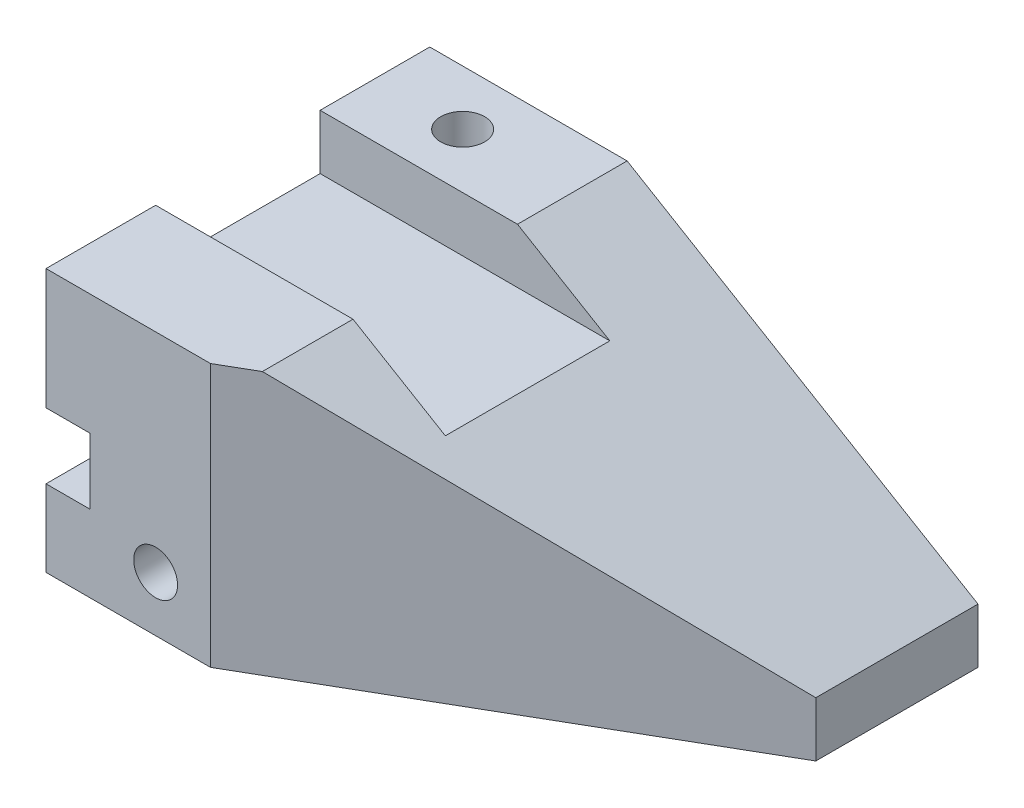
ISO-10303-21;
HEADER;
FILE_DESCRIPTION(('STEP AP214'),'2;1');
FILE_NAME('part.step','',(''),(''),'','','');
FILE_SCHEMA(('AUTOMOTIVE_DESIGN { 1 0 10303 214 1 1 1 1 }'));
ENDSEC;
DATA;
#1=APPLICATION_CONTEXT('core data for automotive mechanical design processes');
#2=APPLICATION_PROTOCOL_DEFINITION('international standard','automotive_design',2000,#1);
#3=PRODUCT_CONTEXT('',#1,'mechanical');
#4=PRODUCT('Part','Part','',(#3));
#5=PRODUCT_RELATED_PRODUCT_CATEGORY('part','',(#4));
#6=PRODUCT_DEFINITION_FORMATION('','',#4);
#7=PRODUCT_DEFINITION_CONTEXT('part definition',#1,'design');
#8=PRODUCT_DEFINITION('design','',#6,#7);
#9=PRODUCT_DEFINITION_SHAPE('','',#8);
#10=(LENGTH_UNIT() NAMED_UNIT(*) SI_UNIT(.MILLI.,.METRE.));
#11=(NAMED_UNIT(*) PLANE_ANGLE_UNIT() SI_UNIT($,.RADIAN.));
#12=(NAMED_UNIT(*) SI_UNIT($,.STERADIAN.) SOLID_ANGLE_UNIT());
#13=UNCERTAINTY_MEASURE_WITH_UNIT(LENGTH_MEASURE(1.E-05),#10,'distance_accuracy_value','');
#14=(GEOMETRIC_REPRESENTATION_CONTEXT(3) GLOBAL_UNCERTAINTY_ASSIGNED_CONTEXT((#13)) GLOBAL_UNIT_ASSIGNED_CONTEXT((#10,
#11,#12)) REPRESENTATION_CONTEXT('',''));
#15=CARTESIAN_POINT('',(0.,0.,0.));
#16=DIRECTION('',(0.,0.,1.));
#17=DIRECTION('',(1.,0.,0.));
#18=AXIS2_PLACEMENT_3D('',#15,#16,#17);
#19=CARTESIAN_POINT('',(0.,0.,175.));
#20=DIRECTION('',(0.,0.,1.));
#21=DIRECTION('',(1.,0.,0.));
#22=AXIS2_PLACEMENT_3D('',#19,#20,#21);
#23=PLANE('',#22);
#24=CARTESIAN_POINT('',(50.,25.,175.));
#25=DIRECTION('',(0.,0.,1.));
#26=DIRECTION('',(1.,0.,0.));
#27=AXIS2_PLACEMENT_3D('',#24,#25,#26);
#28=CIRCLE('',#27,10.);
#29=CARTESIAN_POINT('',(60.,25.,175.));
#30=VERTEX_POINT('',#29);
#31=EDGE_CURVE('E239',#30,#30,#28,.T.);
#32=ORIENTED_EDGE('',*,*,#31,.F.);
#33=EDGE_LOOP('',(#32));
#34=FACE_BOUND('',#33,.T.);
#35=DIRECTION('',(0.,-1.,0.));
#36=VECTOR('',#35,1.);
#37=CARTESIAN_POINT('',(20.,65.,175.));
#38=LINE('',#37,#36);
#39=CARTESIAN_POINT('',(20.,65.,175.));
#40=VERTEX_POINT('',#39);
#41=CARTESIAN_POINT('',(20.,35.,175.));
#42=VERTEX_POINT('',#41);
#43=EDGE_CURVE('E167',#40,#42,#38,.T.);
#44=ORIENTED_EDGE('',*,*,#43,.T.);
#45=DIRECTION('',(-1.,0.,0.));
#46=VECTOR('',#45,1.);
#47=CARTESIAN_POINT('',(20.,35.,175.));
#48=LINE('',#47,#46);
#49=CARTESIAN_POINT('',(0.,35.,175.));
#50=VERTEX_POINT('',#49);
#51=EDGE_CURVE('E152',#42,#50,#48,.T.);
#52=ORIENTED_EDGE('',*,*,#51,.T.);
#53=DIRECTION('',(0.,-1.,0.));
#54=VECTOR('',#53,1.);
#55=CARTESIAN_POINT('',(0.,120.,175.));
#56=LINE('',#55,#54);
#57=CARTESIAN_POINT('',(0.,0.,175.));
#58=VERTEX_POINT('',#57);
#59=EDGE_CURVE('E164',#50,#58,#56,.T.);
#60=ORIENTED_EDGE('',*,*,#59,.T.);
#61=DIRECTION('',(1.,0.,0.));
#62=VECTOR('',#61,1.);
#63=CARTESIAN_POINT('',(0.,0.,175.));
#64=LINE('',#63,#62);
#65=CARTESIAN_POINT('',(75.,0.,175.));
#66=VERTEX_POINT('',#65);
#67=EDGE_CURVE('E182',#58,#66,#64,.T.);
#68=ORIENTED_EDGE('',*,*,#67,.T.);
#69=DIRECTION('',(0.,1.,0.));
#70=VECTOR('',#69,1.);
#71=CARTESIAN_POINT('',(75.,0.,175.));
#72=LINE('',#71,#70);
#73=CARTESIAN_POINT('',(75.,120.,175.));
#74=VERTEX_POINT('',#73);
#75=EDGE_CURVE('E229',#66,#74,#72,.T.);
#76=ORIENTED_EDGE('',*,*,#75,.T.);
#77=DIRECTION('',(-1.,0.,0.));
#78=VECTOR('',#77,1.);
#79=CARTESIAN_POINT('',(90.,120.,175.));
#80=LINE('',#79,#78);
#81=CARTESIAN_POINT('',(0.,120.,175.));
#82=VERTEX_POINT('',#81);
#83=EDGE_CURVE('E192',#74,#82,#80,.T.);
#84=ORIENTED_EDGE('',*,*,#83,.T.);
#85=CARTESIAN_POINT('',(0.,65.,175.));
#86=VERTEX_POINT('',#85);
#87=EDGE_CURVE('E176',#82,#86,#56,.T.);
#88=ORIENTED_EDGE('',*,*,#87,.T.);
#89=DIRECTION('',(1.,0.,0.));
#90=VECTOR('',#89,1.);
#91=CARTESIAN_POINT('',(0.,65.,175.));
#92=LINE('',#91,#90);
#93=EDGE_CURVE('E169',#86,#40,#92,.T.);
#94=ORIENTED_EDGE('',*,*,#93,.T.);
#95=EDGE_LOOP('',(#44,#52,#60,#68,#76,#84,#88,#94));
#96=FACE_BOUND('',#95,.T.);
#97=ADVANCED_FACE('F39',(#34,#96),#23,.T.);
#98=CARTESIAN_POINT('',(0.,120.,175.));
#99=DIRECTION('',(1.,0.,0.));
#100=DIRECTION('',(0.,1.,0.));
#101=AXIS2_PLACEMENT_3D('',#98,#99,#100);
#102=PLANE('',#101);
#103=DIRECTION('',(0.,0.,1.));
#104=VECTOR('',#103,1.);
#105=CARTESIAN_POINT('',(0.,35.,-45.0000000000001));
#106=LINE('',#105,#104);
#107=CARTESIAN_POINT('',(0.,35.,0.));
#108=VERTEX_POINT('',#107);
#109=EDGE_CURVE('E148',#108,#50,#106,.T.);
#110=ORIENTED_EDGE('',*,*,#109,.F.);
#111=DIRECTION('',(0.,-1.,0.));
#112=VECTOR('',#111,1.);
#113=CARTESIAN_POINT('',(0.,120.,0.));
#114=LINE('',#113,#112);
#115=CARTESIAN_POINT('',(0.,0.,0.));
#116=VERTEX_POINT('',#115);
#117=EDGE_CURVE('E201',#108,#116,#114,.T.);
#118=ORIENTED_EDGE('',*,*,#117,.T.);
#119=DIRECTION('',(0.,0.,-1.));
#120=VECTOR('',#119,1.);
#121=CARTESIAN_POINT('',(0.,0.,175.));
#122=LINE('',#121,#120);
#123=EDGE_CURVE('E174',#58,#116,#122,.T.);
#124=ORIENTED_EDGE('',*,*,#123,.F.);
#125=ORIENTED_EDGE('',*,*,#59,.F.);
#126=EDGE_LOOP('',(#110,#118,#124,#125));
#127=FACE_BOUND('',#126,.T.);
#128=ADVANCED_FACE('F41',(#127),#102,.F.);
#129=DIRECTION('',(0.,0.,1.));
#130=VECTOR('',#129,1.);
#131=CARTESIAN_POINT('',(0.,65.,-45.0000000000001));
#132=LINE('',#131,#130);
#133=CARTESIAN_POINT('',(0.,65.,0.));
#134=VERTEX_POINT('',#133);
#135=EDGE_CURVE('E160',#134,#86,#132,.T.);
#136=ORIENTED_EDGE('',*,*,#135,.T.);
#137=ORIENTED_EDGE('',*,*,#87,.F.);
#138=DIRECTION('',(0.,0.,-1.));
#139=VECTOR('',#138,1.);
#140=CARTESIAN_POINT('',(0.,120.,175.));
#141=LINE('',#140,#139);
#142=CARTESIAN_POINT('',(0.,120.,125.));
#143=VERTEX_POINT('',#142);
#144=EDGE_CURVE('E212',#82,#143,#141,.T.);
#145=ORIENTED_EDGE('',*,*,#144,.T.);
#146=DIRECTION('',(0.,1.,0.));
#147=VECTOR('',#146,1.);
#148=CARTESIAN_POINT('',(0.,95.,125.));
#149=LINE('',#148,#147);
#150=CARTESIAN_POINT('',(0.,95.,125.));
#151=VERTEX_POINT('',#150);
#152=EDGE_CURVE('E271',#151,#143,#149,.T.);
#153=ORIENTED_EDGE('',*,*,#152,.F.);
#154=DIRECTION('',(0.,0.,1.));
#155=VECTOR('',#154,1.);
#156=CARTESIAN_POINT('',(0.,95.,50.));
#157=LINE('',#156,#155);
#158=CARTESIAN_POINT('',(0.,95.,50.));
#159=VERTEX_POINT('',#158);
#160=EDGE_CURVE('E267',#159,#151,#157,.T.);
#161=ORIENTED_EDGE('',*,*,#160,.F.);
#162=DIRECTION('',(0.,-1.,0.));
#163=VECTOR('',#162,1.);
#164=CARTESIAN_POINT('',(0.,120.,50.));
#165=LINE('',#164,#163);
#166=CARTESIAN_POINT('',(0.,120.,50.));
#167=VERTEX_POINT('',#166);
#168=EDGE_CURVE('E159',#167,#159,#165,.T.);
#169=ORIENTED_EDGE('',*,*,#168,.F.);
#170=CARTESIAN_POINT('',(0.,120.,0.));
#171=VERTEX_POINT('',#170);
#172=EDGE_CURVE('E195',#167,#171,#141,.T.);
#173=ORIENTED_EDGE('',*,*,#172,.T.);
#174=EDGE_CURVE('E196',#171,#134,#114,.T.);
#175=ORIENTED_EDGE('',*,*,#174,.T.);
#176=EDGE_LOOP('',(#136,#137,#145,#153,#161,#169,#173,#175));
#177=FACE_BOUND('',#176,.T.);
#178=ADVANCED_FACE('F328',(#177),#102,.F.);
#179=CARTESIAN_POINT('',(0.,0.,0.));
#180=DIRECTION('',(0.,0.,1.));
#181=DIRECTION('',(1.,0.,0.));
#182=AXIS2_PLACEMENT_3D('',#179,#180,#181);
#183=PLANE('',#182);
#184=CARTESIAN_POINT('',(50.,25.,0.));
#185=DIRECTION('',(0.,0.,1.));
#186=DIRECTION('',(1.,0.,0.));
#187=AXIS2_PLACEMENT_3D('',#184,#185,#186);
#188=CIRCLE('',#187,10.);
#189=CARTESIAN_POINT('',(60.,25.,0.));
#190=VERTEX_POINT('',#189);
#191=EDGE_CURVE('E170',#190,#190,#188,.T.);
#192=ORIENTED_EDGE('',*,*,#191,.T.);
#193=EDGE_LOOP('',(#192));
#194=FACE_BOUND('',#193,.T.);
#195=DIRECTION('',(-1.,0.,0.));
#196=VECTOR('',#195,1.);
#197=CARTESIAN_POINT('',(0.,35.,0.));
#198=LINE('',#197,#196);
#199=CARTESIAN_POINT('',(20.,35.,0.));
#200=VERTEX_POINT('',#199);
#201=EDGE_CURVE('E11',#200,#108,#198,.T.);
#202=ORIENTED_EDGE('',*,*,#201,.F.);
#203=DIRECTION('',(0.,-1.,0.));
#204=VECTOR('',#203,1.);
#205=CARTESIAN_POINT('',(20.,0.,0.));
#206=LINE('',#205,#204);
#207=CARTESIAN_POINT('',(20.,65.,0.));
#208=VERTEX_POINT('',#207);
#209=EDGE_CURVE('E233',#208,#200,#206,.T.);
#210=ORIENTED_EDGE('',*,*,#209,.F.);
#211=DIRECTION('',(1.,0.,0.));
#212=VECTOR('',#211,1.);
#213=CARTESIAN_POINT('',(0.,65.,0.));
#214=LINE('',#213,#212);
#215=EDGE_CURVE('E54',#134,#208,#214,.T.);
#216=ORIENTED_EDGE('',*,*,#215,.F.);
#217=ORIENTED_EDGE('',*,*,#174,.F.);
#218=DIRECTION('',(-1.,0.,0.));
#219=VECTOR('',#218,1.);
#220=CARTESIAN_POINT('',(90.,120.,0.));
#221=LINE('',#220,#219);
#222=CARTESIAN_POINT('',(90.,120.,0.));
#223=VERTEX_POINT('',#222);
#224=EDGE_CURVE('E177',#223,#171,#221,.T.);
#225=ORIENTED_EDGE('',*,*,#224,.F.);
#226=DIRECTION('',(-0.859854743840735,0.510538754155436,0.));
#227=VECTOR('',#226,1.);
#228=CARTESIAN_POINT('',(250.,25.,0.));
#229=LINE('',#228,#227);
#230=CARTESIAN_POINT('',(250.,25.,0.));
#231=VERTEX_POINT('',#230);
#232=EDGE_CURVE('E184',#231,#223,#229,.T.);
#233=ORIENTED_EDGE('',*,*,#232,.F.);
#234=DIRECTION('',(0.,1.,0.));
#235=VECTOR('',#234,1.);
#236=CARTESIAN_POINT('',(250.,0.,0.));
#237=LINE('',#236,#235);
#238=CARTESIAN_POINT('',(250.,0.,0.));
#239=VERTEX_POINT('',#238);
#240=EDGE_CURVE('E205',#239,#231,#237,.T.);
#241=ORIENTED_EDGE('',*,*,#240,.F.);
#242=DIRECTION('',(1.,0.,0.));
#243=VECTOR('',#242,1.);
#244=CARTESIAN_POINT('',(0.,0.,0.));
#245=LINE('',#244,#243);
#246=EDGE_CURVE('E200',#116,#239,#245,.T.);
#247=ORIENTED_EDGE('',*,*,#246,.F.);
#248=ORIENTED_EDGE('',*,*,#117,.F.);
#249=EDGE_LOOP('',(#202,#210,#216,#217,#225,#233,#241,#247,#248));
#250=FACE_BOUND('',#249,.T.);
#251=ADVANCED_FACE('F315',(#194,#250),#183,.F.);
#252=CARTESIAN_POINT('',(90.,120.,175.));
#253=DIRECTION('',(0.,-1.,0.));
#254=DIRECTION('',(1.,0.,0.));
#255=AXIS2_PLACEMENT_3D('',#252,#253,#254);
#256=PLANE('',#255);
#257=DIRECTION('',(0.,0.,-1.));
#258=VECTOR('',#257,1.);
#259=CARTESIAN_POINT('',(90.,120.,175.));
#260=LINE('',#259,#258);
#261=CARTESIAN_POINT('',(90.,120.,166.339745962156));
#262=VERTEX_POINT('',#261);
#263=CARTESIAN_POINT('',(90.,120.,125.));
#264=VERTEX_POINT('',#263);
#265=EDGE_CURVE('E217',#262,#264,#260,.T.);
#266=ORIENTED_EDGE('',*,*,#265,.T.);
#267=DIRECTION('',(-1.,0.,0.));
#268=VECTOR('',#267,1.);
#269=CARTESIAN_POINT('',(220.,120.,125.));
#270=LINE('',#269,#268);
#271=EDGE_CURVE('E274',#264,#143,#270,.T.);
#272=ORIENTED_EDGE('',*,*,#271,.T.);
#273=ORIENTED_EDGE('',*,*,#144,.F.);
#274=ORIENTED_EDGE('',*,*,#83,.F.);
#275=DIRECTION('',(-0.866025403784438,0.,0.500000000000001));
#276=VECTOR('',#275,1.);
#277=CARTESIAN_POINT('',(86.25,120.,168.504809471617));
#278=LINE('',#277,#276);
#279=EDGE_CURVE('E305',#262,#74,#278,.T.);
#280=ORIENTED_EDGE('',*,*,#279,.F.);
#281=EDGE_LOOP('',(#266,#272,#273,#274,#280));
#282=FACE_BOUND('',#281,.T.);
#283=ADVANCED_FACE('F323',(#282),#256,.F.);
#284=CARTESIAN_POINT('',(0.,0.,175.));
#285=DIRECTION('',(0.,1.,0.));
#286=DIRECTION('',(0.,0.,1.));
#287=AXIS2_PLACEMENT_3D('',#284,#285,#286);
#288=PLANE('',#287);
#289=CARTESIAN_POINT('',(40.,0.,25.));
#290=DIRECTION('',(0.,1.,0.));
#291=DIRECTION('',(0.,0.,1.));
#292=AXIS2_PLACEMENT_3D('',#289,#290,#291);
#293=CIRCLE('',#292,9.99999999999999);
#294=CARTESIAN_POINT('',(40.,0.,35.));
#295=VERTEX_POINT('',#294);
#296=EDGE_CURVE('E244',#295,#295,#293,.T.);
#297=ORIENTED_EDGE('',*,*,#296,.T.);
#298=EDGE_LOOP('',(#297));
#299=FACE_BOUND('',#298,.T.);
#300=DIRECTION('',(-0.866025403784438,0.,0.500000000000001));
#301=VECTOR('',#300,1.);
#302=CARTESIAN_POINT('',(75.,0.,175.));
#303=LINE('',#302,#301);
#304=CARTESIAN_POINT('',(250.,0.,73.9637028918152));
#305=VERTEX_POINT('',#304);
#306=EDGE_CURVE('E298',#305,#66,#303,.T.);
#307=ORIENTED_EDGE('',*,*,#306,.T.);
#308=ORIENTED_EDGE('',*,*,#67,.F.);
#309=ORIENTED_EDGE('',*,*,#123,.T.);
#310=ORIENTED_EDGE('',*,*,#246,.T.);
#311=DIRECTION('',(0.,0.,-1.));
#312=VECTOR('',#311,1.);
#313=CARTESIAN_POINT('',(250.,0.,175.));
#314=LINE('',#313,#312);
#315=EDGE_CURVE('E224',#305,#239,#314,.T.);
#316=ORIENTED_EDGE('',*,*,#315,.F.);
#317=EDGE_LOOP('',(#307,#308,#309,#310,#316));
#318=FACE_BOUND('',#317,.T.);
#319=ADVANCED_FACE('F319',(#299,#318),#288,.F.);
#320=CARTESIAN_POINT('',(250.,0.,175.));
#321=DIRECTION('',(-1.,0.,0.));
#322=DIRECTION('',(0.,0.,1.));
#323=AXIS2_PLACEMENT_3D('',#320,#321,#322);
#324=PLANE('',#323);
#325=DIRECTION('',(0.,-1.,0.));
#326=VECTOR('',#325,1.);
#327=CARTESIAN_POINT('',(250.,220.,73.9637028918152));
#328=LINE('',#327,#326);
#329=CARTESIAN_POINT('',(250.,25.,73.9637028918152));
#330=VERTEX_POINT('',#329);
#331=EDGE_CURVE('E302',#330,#305,#328,.T.);
#332=ORIENTED_EDGE('',*,*,#331,.T.);
#333=ORIENTED_EDGE('',*,*,#315,.T.);
#334=ORIENTED_EDGE('',*,*,#240,.T.);
#335=DIRECTION('',(0.,0.,-1.));
#336=VECTOR('',#335,1.);
#337=CARTESIAN_POINT('',(250.,25.,175.));
#338=LINE('',#337,#336);
#339=EDGE_CURVE('E221',#330,#231,#338,.T.);
#340=ORIENTED_EDGE('',*,*,#339,.F.);
#341=EDGE_LOOP('',(#332,#333,#334,#340));
#342=FACE_BOUND('',#341,.T.);
#343=ADVANCED_FACE('F346',(#342),#324,.F.);
#344=CARTESIAN_POINT('',(250.,25.,175.));
#345=DIRECTION('',(-0.510538754155436,-0.859854743840734,0.));
#346=DIRECTION('',(0.859854743840734,-0.510538754155436,0.));
#347=AXIS2_PLACEMENT_3D('',#344,#345,#346);
#348=PLANE('',#347);
#349=DIRECTION('',(0.,0.,1.));
#350=VECTOR('',#349,1.);
#351=CARTESIAN_POINT('',(132.105263157895,95.,175.));
#352=LINE('',#351,#350);
#353=CARTESIAN_POINT('',(132.105263157895,95.,50.));
#354=VERTEX_POINT('',#353);
#355=CARTESIAN_POINT('',(132.105263157895,95.,125.));
#356=VERTEX_POINT('',#355);
#357=EDGE_CURVE('E290',#354,#356,#352,.T.);
#358=ORIENTED_EDGE('',*,*,#357,.T.);
#359=DIRECTION('',(-0.859854743840734,0.510538754155436,0.));
#360=VECTOR('',#359,1.);
#361=CARTESIAN_POINT('',(250.,25.,125.));
#362=LINE('',#361,#360);
#363=EDGE_CURVE('E294',#356,#264,#362,.T.);
#364=ORIENTED_EDGE('',*,*,#363,.T.);
#365=ORIENTED_EDGE('',*,*,#265,.F.);
#366=DIRECTION('',(-0.770171866280985,0.457289545604335,0.444658934319604));
#367=VECTOR('',#366,1.);
#368=CARTESIAN_POINT('',(215.398725622707,45.5445066615178,93.9407579678495));
#369=LINE('',#368,#367);
#370=EDGE_CURVE('E188',#330,#262,#369,.T.);
#371=ORIENTED_EDGE('',*,*,#370,.F.);
#372=ORIENTED_EDGE('',*,*,#339,.T.);
#373=ORIENTED_EDGE('',*,*,#232,.T.);
#374=CARTESIAN_POINT('',(90.,120.,50.));
#375=VERTEX_POINT('',#374);
#376=EDGE_CURVE('E216',#375,#223,#260,.T.);
#377=ORIENTED_EDGE('',*,*,#376,.F.);
#378=DIRECTION('',(0.859854743840734,-0.510538754155436,0.));
#379=VECTOR('',#378,1.);
#380=CARTESIAN_POINT('',(250.,25.,50.));
#381=LINE('',#380,#379);
#382=EDGE_CURVE('E278',#375,#354,#381,.T.);
#383=ORIENTED_EDGE('',*,*,#382,.T.);
#384=EDGE_LOOP('',(#358,#364,#365,#371,#372,#373,#377,#383));
#385=FACE_BOUND('',#384,.T.);
#386=ADVANCED_FACE('F343',(#385),#348,.F.);
#387=CARTESIAN_POINT('',(40.,120.,25.));
#388=DIRECTION('',(0.,1.,0.));
#389=DIRECTION('',(-1.,0.,0.));
#390=AXIS2_PLACEMENT_3D('',#387,#388,#389);
#391=CIRCLE('',#390,9.99999999999999);
#392=CARTESIAN_POINT('',(30.,120.,25.));
#393=VERTEX_POINT('',#392);
#394=EDGE_CURVE('E509',#393,#393,#391,.T.);
#395=ORIENTED_EDGE('',*,*,#394,.F.);
#396=EDGE_LOOP('',(#395));
#397=FACE_BOUND('',#396,.T.);
#398=ORIENTED_EDGE('',*,*,#172,.F.);
#399=DIRECTION('',(-1.,0.,0.));
#400=VECTOR('',#399,1.);
#401=CARTESIAN_POINT('',(220.,120.,50.));
#402=LINE('',#401,#400);
#403=EDGE_CURVE('E70',#375,#167,#402,.T.);
#404=ORIENTED_EDGE('',*,*,#403,.F.);
#405=ORIENTED_EDGE('',*,*,#376,.T.);
#406=ORIENTED_EDGE('',*,*,#224,.T.);
#407=EDGE_LOOP('',(#398,#404,#405,#406));
#408=FACE_BOUND('',#407,.T.);
#409=ADVANCED_FACE('F340',(#397,#408),#256,.F.);
#410=CARTESIAN_POINT('',(75.,220.,175.));
#411=DIRECTION('',(0.500000000000001,0.,0.866025403784438));
#412=DIRECTION('',(0.866025403784438,0.,-0.500000000000001));
#413=AXIS2_PLACEMENT_3D('',#410,#411,#412);
#414=PLANE('',#413);
#415=ORIENTED_EDGE('',*,*,#370,.T.);
#416=ORIENTED_EDGE('',*,*,#279,.T.);
#417=ORIENTED_EDGE('',*,*,#75,.F.);
#418=ORIENTED_EDGE('',*,*,#306,.F.);
#419=ORIENTED_EDGE('',*,*,#331,.F.);
#420=EDGE_LOOP('',(#415,#416,#417,#418,#419));
#421=FACE_BOUND('',#420,.T.);
#422=ADVANCED_FACE('F347',(#421),#414,.T.);
#423=CARTESIAN_POINT('',(220.,95.,125.));
#424=DIRECTION('',(0.,0.,1.));
#425=DIRECTION('',(1.,0.,0.));
#426=AXIS2_PLACEMENT_3D('',#423,#424,#425);
#427=PLANE('',#426);
#428=DIRECTION('',(-1.,0.,0.));
#429=VECTOR('',#428,1.);
#430=CARTESIAN_POINT('',(220.,95.,125.));
#431=LINE('',#430,#429);
#432=EDGE_CURVE('E279',#356,#151,#431,.T.);
#433=ORIENTED_EDGE('',*,*,#432,.T.);
#434=ORIENTED_EDGE('',*,*,#152,.T.);
#435=ORIENTED_EDGE('',*,*,#271,.F.);
#436=ORIENTED_EDGE('',*,*,#363,.F.);
#437=EDGE_LOOP('',(#433,#434,#435,#436));
#438=FACE_BOUND('',#437,.T.);
#439=ADVANCED_FACE('F349',(#438),#427,.F.);
#440=CARTESIAN_POINT('',(220.,95.,50.));
#441=DIRECTION('',(0.,-1.,0.));
#442=DIRECTION('',(1.,0.,0.));
#443=AXIS2_PLACEMENT_3D('',#440,#441,#442);
#444=PLANE('',#443);
#445=DIRECTION('',(-1.,0.,0.));
#446=VECTOR('',#445,1.);
#447=CARTESIAN_POINT('',(220.,95.,50.));
#448=LINE('',#447,#446);
#449=EDGE_CURVE('E282',#354,#159,#448,.T.);
#450=ORIENTED_EDGE('',*,*,#449,.T.);
#451=ORIENTED_EDGE('',*,*,#160,.T.);
#452=ORIENTED_EDGE('',*,*,#432,.F.);
#453=ORIENTED_EDGE('',*,*,#357,.F.);
#454=EDGE_LOOP('',(#450,#451,#452,#453));
#455=FACE_BOUND('',#454,.T.);
#456=ADVANCED_FACE('F355',(#455),#444,.F.);
#457=CARTESIAN_POINT('',(220.,120.,50.));
#458=DIRECTION('',(0.,0.,-1.));
#459=DIRECTION('',(0.,1.,0.));
#460=AXIS2_PLACEMENT_3D('',#457,#458,#459);
#461=PLANE('',#460);
#462=ORIENTED_EDGE('',*,*,#403,.T.);
#463=ORIENTED_EDGE('',*,*,#168,.T.);
#464=ORIENTED_EDGE('',*,*,#449,.F.);
#465=ORIENTED_EDGE('',*,*,#382,.F.);
#466=EDGE_LOOP('',(#462,#463,#464,#465));
#467=FACE_BOUND('',#466,.T.);
#468=ADVANCED_FACE('F398',(#467),#461,.F.);
#469=CARTESIAN_POINT('',(20.,35.,-45.0000000000001));
#470=DIRECTION('',(0.,1.,0.));
#471=DIRECTION('',(0.,0.,1.));
#472=AXIS2_PLACEMENT_3D('',#469,#470,#471);
#473=PLANE('',#472);
#474=ORIENTED_EDGE('',*,*,#201,.T.);
#475=ORIENTED_EDGE('',*,*,#109,.T.);
#476=ORIENTED_EDGE('',*,*,#51,.F.);
#477=DIRECTION('',(0.,0.,1.));
#478=VECTOR('',#477,1.);
#479=CARTESIAN_POINT('',(20.,35.,-45.0000000000001));
#480=LINE('',#479,#478);
#481=EDGE_CURVE('E257',#200,#42,#480,.T.);
#482=ORIENTED_EDGE('',*,*,#481,.F.);
#483=EDGE_LOOP('',(#474,#475,#476,#482));
#484=FACE_BOUND('',#483,.T.);
#485=ADVANCED_FACE('F150',(#484),#473,.T.);
#486=CARTESIAN_POINT('',(0.,65.,-45.0000000000001));
#487=DIRECTION('',(0.,-1.,0.));
#488=DIRECTION('',(0.,0.,-1.));
#489=AXIS2_PLACEMENT_3D('',#486,#487,#488);
#490=PLANE('',#489);
#491=ORIENTED_EDGE('',*,*,#215,.T.);
#492=DIRECTION('',(0.,0.,1.));
#493=VECTOR('',#492,1.);
#494=CARTESIAN_POINT('',(20.,65.,-45.0000000000001));
#495=LINE('',#494,#493);
#496=EDGE_CURVE('E62',#208,#40,#495,.T.);
#497=ORIENTED_EDGE('',*,*,#496,.T.);
#498=ORIENTED_EDGE('',*,*,#93,.F.);
#499=ORIENTED_EDGE('',*,*,#135,.F.);
#500=EDGE_LOOP('',(#491,#497,#498,#499));
#501=FACE_BOUND('',#500,.T.);
#502=ADVANCED_FACE('F330',(#501),#490,.T.);
#503=CARTESIAN_POINT('',(20.,65.,-45.0000000000001));
#504=DIRECTION('',(-1.,0.,0.));
#505=DIRECTION('',(0.,-1.,0.));
#506=AXIS2_PLACEMENT_3D('',#503,#504,#505);
#507=PLANE('',#506);
#508=ORIENTED_EDGE('',*,*,#209,.T.);
#509=ORIENTED_EDGE('',*,*,#481,.T.);
#510=ORIENTED_EDGE('',*,*,#43,.F.);
#511=ORIENTED_EDGE('',*,*,#496,.F.);
#512=EDGE_LOOP('',(#508,#509,#510,#511));
#513=FACE_BOUND('',#512,.T.);
#514=ADVANCED_FACE('F333',(#513),#507,.T.);
#515=CARTESIAN_POINT('',(50.,25.,-45.0000000000001));
#516=DIRECTION('',(0.,0.,1.));
#517=DIRECTION('',(1.,0.,0.));
#518=AXIS2_PLACEMENT_3D('',#515,#516,#517);
#519=CYLINDRICAL_SURFACE('',#518,10.);
#520=CARTESIAN_POINT('',(40.,25.,15.));
#521=CARTESIAN_POINT('',(40.0000011164459,24.7215266882891,14.9999983146634));
#522=CARTESIAN_POINT('',(40.0116403564845,24.4430290681907,14.9999792243752));
#523=CARTESIAN_POINT('',(40.0581217209357,23.8879543489887,15.000142444646));
#524=CARTESIAN_POINT('',(40.0929667877921,23.6113774979282,15.0003247807474));
#525=CARTESIAN_POINT('',(40.1856528956024,23.0618886018071,15.0016160366222));
#526=CARTESIAN_POINT('',(40.2435111394079,22.7889794565643,15.0027256502405));
#527=CARTESIAN_POINT('',(40.3818138239536,22.2489678205504,15.007052522797));
#528=CARTESIAN_POINT('',(40.4622576639304,21.9818651755335,15.0102697256775));
#529=CARTESIAN_POINT('',(40.645268345221,21.4550237766495,15.0204191660207));
#530=CARTESIAN_POINT('',(40.7478638321737,21.1952950552198,15.0273562312596));
#531=CARTESIAN_POINT('',(40.9743283934104,20.6854843564942,15.0469303827911));
#532=CARTESIAN_POINT('',(41.0981979458322,20.43540259617,15.0595675972057));
#533=CARTESIAN_POINT('',(41.3661237326018,19.9469061099969,15.0928350991113));
#534=CARTESIAN_POINT('',(41.5101752813542,19.7084886933569,15.1134635332606));
#535=CARTESIAN_POINT('',(41.817077985024,19.2452668607079,15.1652437679981));
#536=CARTESIAN_POINT('',(41.9799279402998,19.0204615774196,15.1963948973127));
#537=CARTESIAN_POINT('',(42.3158521534596,18.5949676072055,15.2703943660544));
#538=CARTESIAN_POINT('',(42.4882772324727,18.3936795201838,15.3127374483476));
#539=CARTESIAN_POINT('',(42.846599362183,18.0072706781929,15.4119132233874));
#540=CARTESIAN_POINT('',(43.0324961017725,17.8221495500896,15.4687455816022));
#541=CARTESIAN_POINT('',(43.4147726370236,17.4699112503691,15.5989348053312));
#542=CARTESIAN_POINT('',(43.6111376626287,17.3027696663155,15.6722688355337));
#543=CARTESIAN_POINT('',(44.0112941604236,16.9874943066421,15.8372327086101));
#544=CARTESIAN_POINT('',(44.2150843338814,16.8393572272444,15.9288593643617));
#545=CARTESIAN_POINT('',(44.5983287925194,16.5816983418815,16.1177365682061));
#546=CARTESIAN_POINT('',(44.7773171803953,16.4696651463477,16.2125213803919));
#547=CARTESIAN_POINT('',(45.1354935725863,16.2604589682048,16.4169235628215));
#548=CARTESIAN_POINT('',(45.3146815548079,16.1632844791624,16.5265394273089));
#549=CARTESIAN_POINT('',(45.6707022390899,15.9835170774839,16.7605511042298));
#550=CARTESIAN_POINT('',(45.8475348608862,15.9009246605956,16.8849474189149));
#551=CARTESIAN_POINT('',(46.1963977333386,15.7496614130273,17.1480964633108));
#552=CARTESIAN_POINT('',(46.3684279560745,15.680990663271,17.2868492764659));
#553=CARTESIAN_POINT('',(46.695666478232,15.5601895179319,17.5695183320301));
#554=CARTESIAN_POINT('',(46.8512714674933,15.5073300498335,17.7126664931691));
#555=CARTESIAN_POINT('',(47.1546328332291,15.412030108983,18.010266415895));
#556=CARTESIAN_POINT('',(47.3023896268452,15.3695890820424,18.1647175756736));
#557=CARTESIAN_POINT('',(47.5887239914908,15.2939355425705,18.4840751676932));
#558=CARTESIAN_POINT('',(47.727299743304,15.2607248548831,18.6489836594521));
#559=CARTESIAN_POINT('',(47.9941295174867,15.2022888770716,18.9883037740977));
#560=CARTESIAN_POINT('',(48.1223823159057,15.1770645328185,19.1627165197657));
#561=CARTESIAN_POINT('',(48.3797789693295,15.1311788765876,19.5377644001179));
#562=CARTESIAN_POINT('',(48.5077554405053,15.1112159796213,19.7392866088957));
#563=CARTESIAN_POINT('',(48.7491622061605,15.0777896181452,20.1513715066131));
#564=CARTESIAN_POINT('',(48.8625917781589,15.0643264763581,20.3619346438835));
#565=CARTESIAN_POINT('',(49.0742000077211,15.0423788776824,20.7909471563753));
#566=CARTESIAN_POINT('',(49.1723720203242,15.0338965856065,21.0093999169213));
#567=CARTESIAN_POINT('',(49.3528214926984,15.0205538899727,21.4528812433953));
#568=CARTESIAN_POINT('',(49.4350981574848,15.0156936675331,21.6779101375722));
#569=CARTESIAN_POINT('',(49.5925703921443,15.0079537625698,22.1618362778823));
#570=CARTESIAN_POINT('',(49.6655923719516,15.0053979213446,22.4214486575824));
#571=CARTESIAN_POINT('',(49.7904369883785,15.0020010486283,22.9457420940543));
#572=CARTESIAN_POINT('',(49.8422580645708,15.0011601433418,23.2104235224174));
#573=CARTESIAN_POINT('',(49.9243615242223,15.0002015633949,23.7431441326735));
#574=CARTESIAN_POINT('',(49.9546411665104,15.0000839807636,24.0111837374834));
#575=CARTESIAN_POINT('',(49.9934525043353,14.9999833760136,24.5488305336989));
#576=CARTESIAN_POINT('',(50.0019841162023,15.0000003544127,24.8184377311313));
#577=CARTESIAN_POINT('',(49.9971441228787,14.9999996461873,25.3686281628883));
#578=CARTESIAN_POINT('',(49.9828511699966,14.9999804954396,25.6492037434827));
#579=CARTESIAN_POINT('',(49.9307164812398,15.0002062691512,26.2081662788875));
#580=CARTESIAN_POINT('',(49.8928738393782,15.0004512037704,26.4865531490781));
#581=CARTESIAN_POINT('',(49.7938892920078,15.0020018801135,27.0392598661462));
#582=CARTESIAN_POINT('',(49.7327386971544,15.0033080176658,27.3135781565605));
#583=CARTESIAN_POINT('',(49.5875781166205,15.0082445496896,27.8560792997304));
#584=CARTESIAN_POINT('',(49.5035682450202,15.011874932562,28.1242621830977));
#585=CARTESIAN_POINT('',(49.3132176235734,15.0231556380334,28.6527998383431));
#586=CARTESIAN_POINT('',(49.2068552128686,15.0308098708504,28.9131467348829));
#587=CARTESIAN_POINT('',(48.9726868020494,15.052214135659,29.423774287147));
#588=CARTESIAN_POINT('',(48.8448803855981,15.0659642860118,29.6740547473137));
#589=CARTESIAN_POINT('',(48.5689827853483,15.1019431288027,30.1624776442033));
#590=CARTESIAN_POINT('',(48.4208966257743,15.1241697236626,30.4006230673441));
#591=CARTESIAN_POINT('',(48.105920141358,15.1797139525202,30.8627835021476));
#592=CARTESIAN_POINT('',(47.9390312810137,15.2130307231249,31.0867996121922));
#593=CARTESIAN_POINT('',(47.5971951138057,15.2914619166384,31.5078763117566));
#594=CARTESIAN_POINT('',(47.4230647406766,15.3359051290576,31.7057240419037));
#595=CARTESIAN_POINT('',(47.0618562237645,15.4395297721182,32.0851085890648));
#596=CARTESIAN_POINT('',(46.8747785005289,15.4987107242199,32.2666459354224));
#597=CARTESIAN_POINT('',(46.4907253262363,15.633765308646,32.6116371506125));
#598=CARTESIAN_POINT('',(46.2937639036589,15.7096157707687,32.7751156514535));
#599=CARTESIAN_POINT('',(45.8930364406199,15.8796832327608,33.0830651200806));
#600=CARTESIAN_POINT('',(45.6892715555971,15.9738971269655,33.2275392950104));
#601=CARTESIAN_POINT('',(45.3069347994945,16.1674160689057,33.4782851675424));
#602=CARTESIAN_POINT('',(45.1287523357141,16.264238829657,33.5870781903865));
#603=CARTESIAN_POINT('',(44.7726324372209,16.4725641749792,33.7899923217031));
#604=CARTESIAN_POINT('',(44.5946949791114,16.5840652430382,33.8841149436796));
#605=CARTESIAN_POINT('',(44.2415567036752,16.8216368353667,34.0580325365145));
#606=CARTESIAN_POINT('',(44.0663560989823,16.9477084853373,34.1378263991367));
#607=CARTESIAN_POINT('',(43.7210736500395,17.2139479186347,34.2837896513228));
#608=CARTESIAN_POINT('',(43.550991865561,17.3541158664781,34.3499588818474));
#609=CARTESIAN_POINT('',(43.2266374859396,17.6402504381331,34.4666247942715));
#610=CARTESIAN_POINT('',(43.0720014975421,17.785550519313,34.5177514255096));
#611=CARTESIAN_POINT('',(42.7708469207061,18.0873457757059,34.6097450746196));
#612=CARTESIAN_POINT('',(42.6243279395343,18.2438404084408,34.6506125892073));
#613=CARTESIAN_POINT('',(42.3407026388801,18.5671605963453,34.723299544356));
#614=CARTESIAN_POINT('',(42.2035982082615,18.7339882119499,34.7551171732171));
#615=CARTESIAN_POINT('',(41.939911532974,19.0770119654045,34.8109587499769));
#616=CARTESIAN_POINT('',(41.8133305356813,19.2532092098194,34.8349817749332));
#617=CARTESIAN_POINT('',(41.5590921257166,19.6326478232684,34.878641116363));
#618=CARTESIAN_POINT('',(41.4326749134624,19.8368024217246,34.8975676918827));
#619=CARTESIAN_POINT('',(41.1946817404239,20.2540471015614,34.9291061848874));
#620=CARTESIAN_POINT('',(41.0831065572423,20.4671376503451,34.9417177716133));
#621=CARTESIAN_POINT('',(40.8754855416091,20.9010837985686,34.9621491158387));
#622=CARTESIAN_POINT('',(40.7794464666653,21.1219427263288,34.9699667923065));
#623=CARTESIAN_POINT('',(40.6035262313126,21.5700962422514,34.9821605760199));
#624=CARTESIAN_POINT('',(40.5236458411645,21.7973911366185,34.9865365192319));
#625=CARTESIAN_POINT('',(40.3716939899737,22.2854446811443,34.9934146408792));
#626=CARTESIAN_POINT('',(40.3017872724925,22.5468841120601,34.9956206009501));
#627=CARTESIAN_POINT('',(40.1833857635917,23.0745854757909,34.9984937112105));
#628=CARTESIAN_POINT('',(40.1348925326733,23.3408477585983,34.9991607492664));
#629=CARTESIAN_POINT('',(40.059637756651,23.8764611806467,34.9998931775454));
#630=CARTESIAN_POINT('',(40.0328787913523,24.1458126827236,34.9999584963553));
#631=CARTESIAN_POINT('',(40.001278843765,24.6857958329383,35.0000123350354));
#632=CARTESIAN_POINT('',(39.9964379151906,24.9564274842117,35.0000008547173));
#633=CARTESIAN_POINT('',(40.0089411373326,25.5075111309638,34.9999984382616));
#634=CARTESIAN_POINT('',(40.0271381230517,25.7879441633331,35.0000083020504));
#635=CARTESIAN_POINT('',(40.0870620673378,26.346292452514,34.9996656532564));
#636=CARTESIAN_POINT('',(40.1287898927215,26.6242076161903,34.9993131273237));
#637=CARTESIAN_POINT('',(40.2355002442693,27.175647405551,34.9973689148051));
#638=CARTESIAN_POINT('',(40.3004918237154,27.44917027858,34.995776745518));
#639=CARTESIAN_POINT('',(40.453258816923,27.9897529234238,34.9900147067361));
#640=CARTESIAN_POINT('',(40.5410341112163,28.2568127291202,34.9858448507575));
#641=CARTESIAN_POINT('',(40.7387509685806,28.7826157526051,34.9731669019958));
#642=CARTESIAN_POINT('',(40.8487008527489,29.04135580599,34.9646571788234));
#643=CARTESIAN_POINT('',(41.0898679523031,29.5484464728675,34.941169882337));
#644=CARTESIAN_POINT('',(41.2210855786125,29.7967968855005,34.9261921840432));
#645=CARTESIAN_POINT('',(41.5035631638294,30.2810123487141,34.887345845633));
#646=CARTESIAN_POINT('',(41.6548165698527,30.5168814462751,34.8634801078279));
#647=CARTESIAN_POINT('',(41.9758215825602,30.974158224157,34.8042209936757));
#648=CARTESIAN_POINT('',(42.1455716157261,31.1955671320552,34.7688285973993));
#649=CARTESIAN_POINT('',(42.4918319759683,31.6103243854764,34.6861087687438));
#650=CARTESIAN_POINT('',(42.6674777309813,31.8045431129839,34.6395318717799));
#651=CARTESIAN_POINT('',(43.0311645171927,32.1765572176761,34.5314221090521));
#652=CARTESIAN_POINT('',(43.2192050932104,32.3543531973858,34.4698897922801));
#653=CARTESIAN_POINT('',(43.6045862274015,32.6918265488932,34.330000423647));
#654=CARTESIAN_POINT('',(43.8019139269298,32.8515279865686,34.2516661296928));
#655=CARTESIAN_POINT('',(44.2027435537032,33.1519640653743,34.0766032555296));
#656=CARTESIAN_POINT('',(44.4062444646534,33.2927018079562,33.9798776894085));
#657=CARTESIAN_POINT('',(44.7873852201811,33.5365427589089,33.7818277813115));
#658=CARTESIAN_POINT('',(44.9647143599582,33.6421591590487,33.6829843032941));
#659=CARTESIAN_POINT('',(45.3186956666386,33.8389128702199,33.4707755827975));
#660=CARTESIAN_POINT('',(45.4953479021709,33.9300516891383,33.3574118548738));
#661=CARTESIAN_POINT('',(45.8455462757124,34.0982562282776,33.1163284383137));
#662=CARTESIAN_POINT('',(46.0190920696661,34.1753203982465,32.9886071707664));
#663=CARTESIAN_POINT('',(46.3607620675747,34.3161202442912,32.7193274974636));
#664=CARTESIAN_POINT('',(46.5288861787305,34.3798556923309,32.5777688550308));
#665=CARTESIAN_POINT('',(46.850351470757,34.492493509149,32.2881685528541));
#666=CARTESIAN_POINT('',(47.0040175870948,34.5419283900998,32.140692907456));
#667=CARTESIAN_POINT('',(47.3029644435196,34.6306965319439,31.8346519961802));
#668=CARTESIAN_POINT('',(47.4482455481953,34.6700302323032,31.6760872131331));
#669=CARTESIAN_POINT('',(47.7291627617078,34.7398283296333,31.3487458759527));
#670=CARTESIAN_POINT('',(47.8647968109673,34.7702908369377,31.1799671553672));
#671=CARTESIAN_POINT('',(48.1253383755597,34.8236108721562,30.8331746784305));
#672=CARTESIAN_POINT('',(48.2502447838564,34.8464676158934,30.6551599720076));
#673=CARTESIAN_POINT('',(48.501268829404,34.8879567766381,30.2712912786493));
#674=CARTESIAN_POINT('',(48.6260746652387,34.9058714539235,30.064501165536));
#675=CARTESIAN_POINT('',(48.8605491969964,34.9355735638329,29.6420938039798));
#676=CARTESIAN_POINT('',(48.9702170608309,34.9473606597406,29.4264760711533));
#677=CARTESIAN_POINT('',(49.1737434744377,34.9663310518489,28.9876011869276));
#678=CARTESIAN_POINT('',(49.2675952062951,34.9735123663427,28.7643407906184));
#679=CARTESIAN_POINT('',(49.4388762966091,34.9846133980456,28.3115283370578));
#680=CARTESIAN_POINT('',(49.5163048742468,34.9885329602044,28.0819759812483));
#681=CARTESIAN_POINT('',(49.6626140034475,34.9946074129394,27.5898770976581));
#682=CARTESIAN_POINT('',(49.7293436268283,34.9964930853137,27.3266851493584));
#683=CARTESIAN_POINT('',(49.8411872704906,34.9988952903233,26.7957316658985));
#684=CARTESIAN_POINT('',(49.8862997334621,34.9994117243302,26.5279698029581));
#685=CARTESIAN_POINT('',(49.9546095710301,34.9999555194477,25.9896318277555));
#686=CARTESIAN_POINT('',(49.977804492298,34.9999828258143,25.7190554038731));
#687=CARTESIAN_POINT('',(50.0021163489543,35.0000070948822,25.1769151186877));
#688=CARTESIAN_POINT('',(50.003233258387,35.0000040575479,24.9053512562242));
#689=CARTESIAN_POINT('',(49.9830330921751,34.999991242259,24.3535366798427));
#690=CARTESIAN_POINT('',(49.9609298407886,34.9999812322142,24.073314416796));
#691=CARTESIAN_POINT('',(49.8932190861291,34.999486947376,23.5157168177358));
#692=CARTESIAN_POINT('',(49.8476107544143,34.9990026558659,23.2383415824179));
#693=CARTESIAN_POINT('',(49.7331909149938,34.9966036804603,22.6883052540718));
#694=CARTESIAN_POINT('',(49.6643700261593,34.9946884178711,22.4156461139179));
#695=CARTESIAN_POINT('',(49.5040274633244,34.9880150345097,21.8771183306505));
#696=CARTESIAN_POINT('',(49.4125059165736,34.9832569296731,21.611249649482));
#697=CARTESIAN_POINT('',(49.2074770942285,34.9690750922547,21.0883234667855));
#698=CARTESIAN_POINT('',(49.0939753393983,34.9596525303206,20.8312637717485));
#699=CARTESIAN_POINT('',(48.8458918579636,34.9339608376995,20.3278559021358));
#700=CARTESIAN_POINT('',(48.7113097271753,34.9176915757272,20.0815079330569));
#701=CARTESIAN_POINT('',(48.4223600246433,34.8758465358451,19.6016436684526));
#702=CARTESIAN_POINT('',(48.2680005601491,34.8502745635042,19.3681221707491));
#703=CARTESIAN_POINT('',(47.9411056846822,34.7871673409409,18.9158684937664));
#704=CARTESIAN_POINT('',(47.7685719547891,34.7496331965437,18.6971349497016));
#705=CARTESIAN_POINT('',(47.4181006708314,34.6625279482954,18.2888250230139));
#706=CARTESIAN_POINT('',(47.241072534721,34.6137912805602,18.0982911145299));
#707=CARTESIAN_POINT('',(46.8751838678025,34.5011652008818,17.7337413113927));
#708=CARTESIAN_POINT('',(46.6863238213558,34.4372764089214,17.5597247413037));
#709=CARTESIAN_POINT('',(46.2999040876294,34.292566120225,17.2298221161031));
#710=CARTESIAN_POINT('',(46.1023560173957,34.2117667222829,17.0739128078397));
#711=CARTESIAN_POINT('',(45.7017133980848,34.0317724598757,16.7809967542715));
#712=CARTESIAN_POINT('',(45.4986197293429,33.9325805008247,16.643987029413));
#713=CARTESIAN_POINT('',(45.1188502962609,33.7300678360191,16.4069592424777));
#714=CARTESIAN_POINT('',(44.9424067727524,33.6292167343097,16.3044458427615));
#715=CARTESIAN_POINT('',(44.5906158475562,33.4131535391466,16.1137032955047));
#716=CARTESIAN_POINT('',(44.4152683328372,33.2979429531304,16.0254726508132));
#717=CARTESIAN_POINT('',(44.0680402759036,33.0533817455005,15.8628329211984));
#718=CARTESIAN_POINT('',(43.8961601397076,32.924029479197,15.7884254466441));
#719=CARTESIAN_POINT('',(43.5581118158154,32.651743626323,15.6526459846302));
#720=CARTESIAN_POINT('',(43.3919437529485,32.5088097432022,15.5912742818972));
#721=CARTESIAN_POINT('',(43.0733712524076,32.2157401297128,15.4825601810534));
#722=CARTESIAN_POINT('',(42.9206845863561,32.0660723247978,15.4347796461616));
#723=CARTESIAN_POINT('',(42.6239630243341,31.7557505398152,15.3491624106906));
#724=CARTESIAN_POINT('',(42.4799278068571,31.5950969684776,15.3113253404142));
#725=CARTESIAN_POINT('',(42.2017217861114,31.2636798324018,15.2443398266655));
#726=CARTESIAN_POINT('',(42.0675541122047,31.092913091135,15.2151941306735));
#727=CARTESIAN_POINT('',(41.8101504877195,30.7422713618022,15.1643214960131));
#728=CARTESIAN_POINT('',(41.6869156609179,30.5623954403903,15.1425953193374));
#729=CARTESIAN_POINT('',(41.4391321418379,30.1740065156911,15.1032151938552));
#730=CARTESIAN_POINT('',(41.3159677085323,29.9645361567517,15.0862849500265));
#731=CARTESIAN_POINT('',(41.085076273566,29.5368714801268,15.0583634338877));
#732=CARTESIAN_POINT('',(40.9773505078055,29.3186764657993,15.0473726368488));
#733=CARTESIAN_POINT('',(40.77803755933,28.874865834042,15.0298109775623));
#734=CARTESIAN_POINT('',(40.6864507323938,28.6492500531535,15.0232402127441));
#735=CARTESIAN_POINT('',(40.5199652906664,28.1918902978248,15.0131789366366));
#736=CARTESIAN_POINT('',(40.4450659426864,27.9601465931245,15.009688289998));
#737=CARTESIAN_POINT('',(40.3160027860574,27.5046224267663,15.00479725637));
#738=CARTESIAN_POINT('',(40.2609284184571,27.2811003710972,15.0032929178517));
#739=CARTESIAN_POINT('',(40.1663278311717,26.8307972543972,15.0012713005164));
#740=CARTESIAN_POINT('',(40.1268007668582,26.6040163711005,15.0007539680731));
#741=CARTESIAN_POINT('',(40.0634784829022,26.1482488409551,15.000151206601));
#742=CARTESIAN_POINT('',(40.0396844852492,25.9192620241723,15.0000658111174));
#743=CARTESIAN_POINT('',(40.0079443585445,25.4601890427438,14.9999909015496));
#744=CARTESIAN_POINT('',(39.9999990774795,25.2301028199346,15.0000013925956));
#745=CARTESIAN_POINT('',(40.,25.,15.));
#746=B_SPLINE_CURVE_WITH_KNOTS('',3,(#520,#521,#522,#523,#524,#525,#526,#527,#528,#529,#530,
#531,#532,#533,#534,#535,#536,#537,#538,#539,#540,#541,#542,#543,#544,#545,#546,#547,#548,#549,
#550,#551,#552,#553,#554,#555,#556,#557,#558,#559,#560,#561,#562,#563,#564,#565,#566,#567,#568,
#569,#570,#571,#572,#573,#574,#575,#576,#577,#578,#579,#580,#581,#582,#583,#584,#585,#586,#587,
#588,#589,#590,#591,#592,#593,#594,#595,#596,#597,#598,#599,#600,#601,#602,#603,#604,#605,#606,
#607,#608,#609,#610,#611,#612,#613,#614,#615,#616,#617,#618,#619,#620,#621,#622,#623,#624,#625,
#626,#627,#628,#629,#630,#631,#632,#633,#634,#635,#636,#637,#638,#639,#640,#641,#642,#643,#644,
#645,#646,#647,#648,#649,#650,#651,#652,#653,#654,#655,#656,#657,#658,#659,#660,#661,#662,#663,
#664,#665,#666,#667,#668,#669,#670,#671,#672,#673,#674,#675,#676,#677,#678,#679,#680,#681,#682,
#683,#684,#685,#686,#687,#688,#689,#690,#691,#692,#693,#694,#695,#696,#697,#698,#699,#700,#701,
#702,#703,#704,#705,#706,#707,#708,#709,#710,#711,#712,#713,#714,#715,#716,#717,#718,#719,#720,
#721,#722,#723,#724,#725,#726,#727,#728,#729,#730,#731,#732,#733,#734,#735,#736,#737,#738,#739,
#740,#741,#742,#743,#744,#745),.UNSPECIFIED.,.T.,.F.,(4,2,2,2,2,2,2,2,2,2,2,2,2,2,2,2,2,2,2,2,2,
2,2,2,2,2,2,2,2,2,2,2,2,2,2,2,2,2,2,2,2,2,2,2,2,2,2,2,2,2,2,2,2,2,2,2,2,2,2,2,2,2,2,2,2,2,2,2,2,
2,2,2,2,2,2,2,2,2,2,2,2,2,2,2,2,2,2,2,2,2,2,2,2,2,2,2,2,2,2,2,2,2,2,2,2,2,2,2,2,2,2,2,4),(0.,
0.835219315823839,1.67054455564699,2.50649539637691,3.3424240034158,4.1794401449311,
5.01647510097177,5.85331604608714,6.69010361674426,7.49415668615832,8.29819119308944,
9.10111983128427,9.90390869720029,10.5973564861147,11.2907339239207,11.9841349299951,
12.6775399665425,13.3306675969389,13.9837604779621,14.6369823841668,15.2902816264811,
16.0082199624762,16.7261939415289,17.4444797410677,18.1628014554178,18.9709881881105,
19.7792343942063,20.5875834321336,21.3959355799683,22.2377510635274,23.079598934822,
23.9217609595136,24.7639187814418,25.6068964958559,26.4498905786349,27.2926761895871,
28.1353962032795,28.9360896474037,29.7367570961117,30.5363185977945,31.3357449929992,
32.0252239078352,32.7146316439226,33.4040926782601,34.0935617601653,34.7476545198015,
35.4017156041167,36.0559075331526,36.7101768954141,37.4320495595321,38.153960029083,
38.8761836578082,39.5984417057683,40.4094252583362,41.2204679013231,42.0316067990562,
42.8427476846371,43.6848130463701,44.5269094296933,45.3693338786951,46.2117539104659,
47.0544906536528,47.8972436816687,48.7397217570479,49.5821282182191,50.3788930034878,
51.1756285450855,51.97129166496,52.766824498322,53.4524673024481,54.1380386477671,
54.8236854598467,55.5093440014321,56.1645915106387,56.8198105075452,57.4751689717225,
58.1305949843804,58.8564424488993,59.5823297951813,60.3085292562377,61.0347632358286,
61.8484178594893,62.6621310903922,63.4759353930803,64.2897406525082,65.1320152886811,
65.974319613038,66.8169647551737,67.6596051739337,68.5020342207488,69.3444794218281,
70.1865803807748,71.0286035155147,71.8212748967883,72.6139138497484,73.4055233777507,
74.1970079640963,74.8789960178852,75.56091253778,76.2429084497001,76.9249192562071,
77.5814744916502,78.2380053129626,78.8947434545421,79.5515490235812,80.2815549923216,
81.0116193670877,81.7416998339235,82.4717482172779,83.1618378870274,83.8518900615401,
84.5419958262126,85.2321385140489),.UNSPECIFIED.);
#747=CARTESIAN_POINT('',(40.,25.,15.));
#748=VERTEX_POINT('',#747);
#749=EDGE_CURVE('E43',#748,#748,#746,.T.);
#750=ORIENTED_EDGE('',*,*,#749,.T.);
#751=EDGE_LOOP('',(#750));
#752=FACE_BOUND('',#751,.T.);
#753=ORIENTED_EDGE('',*,*,#31,.T.);
#754=EDGE_LOOP('',(#753));
#755=FACE_BOUND('',#754,.T.);
#756=ORIENTED_EDGE('',*,*,#191,.F.);
#757=EDGE_LOOP('',(#756));
#758=FACE_BOUND('',#757,.T.);
#759=ADVANCED_FACE('F382',(#752,#755,#758),#519,.F.);
#760=CARTESIAN_POINT('',(40.,-100.,25.));
#761=DIRECTION('',(0.,1.,0.));
#762=DIRECTION('',(-1.,0.,0.));
#763=AXIS2_PLACEMENT_3D('',#760,#761,#762);
#764=CYLINDRICAL_SURFACE('',#763,9.99999999999999);
#765=ORIENTED_EDGE('',*,*,#749,.F.);
#766=EDGE_LOOP('',(#765));
#767=FACE_BOUND('',#766,.T.);
#768=ORIENTED_EDGE('',*,*,#394,.T.);
#769=EDGE_LOOP('',(#768));
#770=FACE_BOUND('',#769,.T.);
#771=ORIENTED_EDGE('',*,*,#296,.F.);
#772=EDGE_LOOP('',(#771));
#773=FACE_BOUND('',#772,.T.);
#774=ADVANCED_FACE('F380',(#767,#770,#773),#764,.F.);
#775=CLOSED_SHELL('',(#97,#128,#178,#251,#283,#319,#343,#386,#409,#422,#439,#456,#468,#485,#502,
#514,#759,#774));
#776=MANIFOLD_SOLID_BREP('B2',#775);
#777=ADVANCED_BREP_SHAPE_REPRESENTATION('',(#18,#776),#14);
#778=SHAPE_DEFINITION_REPRESENTATION(#9,#777);
ENDSEC;
END-ISO-10303-21;
